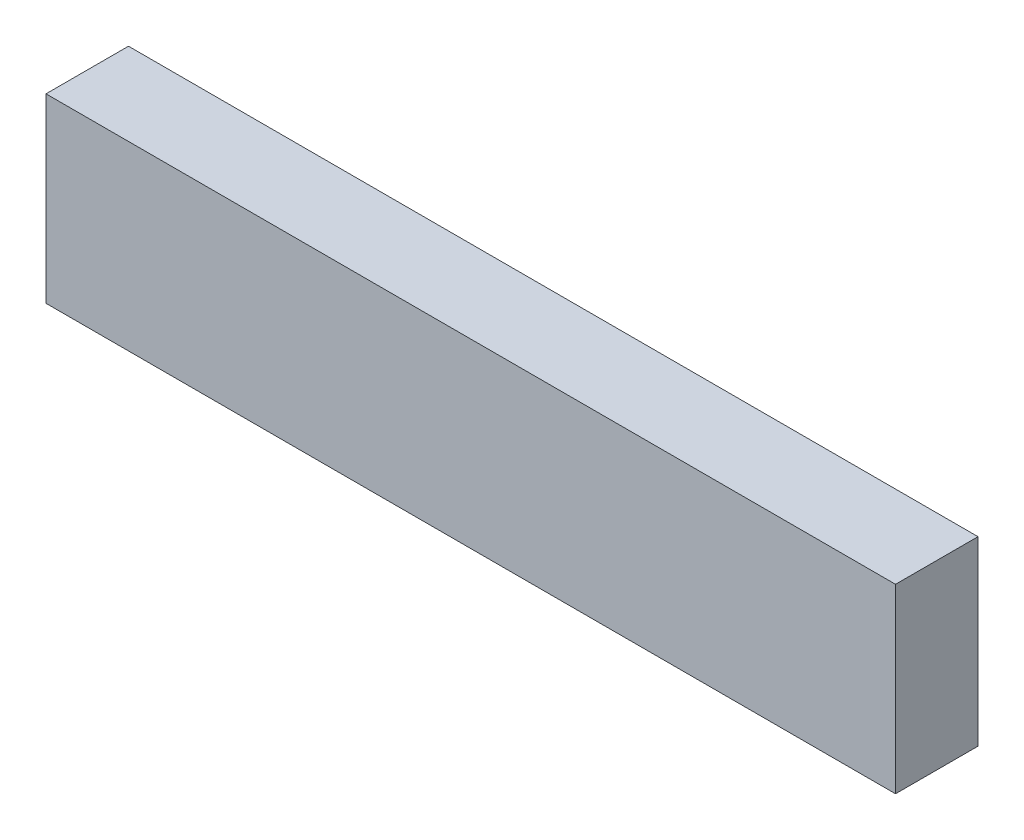
ISO-10303-21;
HEADER;
FILE_DESCRIPTION(('STEP AP214'),'2;1');
FILE_NAME('part.step','',(''),(''),'','','');
FILE_SCHEMA(('AUTOMOTIVE_DESIGN { 1 0 10303 214 1 1 1 1 }'));
ENDSEC;
DATA;
#1=APPLICATION_CONTEXT('core data for automotive mechanical design processes');
#2=APPLICATION_PROTOCOL_DEFINITION('international standard','automotive_design',2000,#1);
#3=PRODUCT_CONTEXT('',#1,'mechanical');
#4=PRODUCT('Part','Part','',(#3));
#5=PRODUCT_RELATED_PRODUCT_CATEGORY('part','',(#4));
#6=PRODUCT_DEFINITION_FORMATION('','',#4);
#7=PRODUCT_DEFINITION_CONTEXT('part definition',#1,'design');
#8=PRODUCT_DEFINITION('design','',#6,#7);
#9=PRODUCT_DEFINITION_SHAPE('','',#8);
#10=(LENGTH_UNIT() NAMED_UNIT(*) SI_UNIT(.MILLI.,.METRE.));
#11=(NAMED_UNIT(*) PLANE_ANGLE_UNIT() SI_UNIT($,.RADIAN.));
#12=(NAMED_UNIT(*) SI_UNIT($,.STERADIAN.) SOLID_ANGLE_UNIT());
#13=UNCERTAINTY_MEASURE_WITH_UNIT(LENGTH_MEASURE(1.E-05),#10,'distance_accuracy_value','');
#14=(GEOMETRIC_REPRESENTATION_CONTEXT(3) GLOBAL_UNCERTAINTY_ASSIGNED_CONTEXT((#13)) GLOBAL_UNIT_ASSIGNED_CONTEXT((#10,
#11,#12)) REPRESENTATION_CONTEXT('',''));
#15=CARTESIAN_POINT('',(0.,0.,0.));
#16=DIRECTION('',(0.,0.,1.));
#17=DIRECTION('',(1.,0.,0.));
#18=AXIS2_PLACEMENT_3D('',#15,#16,#17);
#19=CARTESIAN_POINT('',(25.75,11.,2.5));
#20=DIRECTION('',(-1.,0.,0.));
#21=DIRECTION('',(0.,0.,1.));
#22=AXIS2_PLACEMENT_3D('',#19,#20,#21);
#23=PLANE('',#22);
#24=DIRECTION('',(0.,0.,-1.));
#25=VECTOR('',#24,1.);
#26=CARTESIAN_POINT('',(25.75,0.,2.5));
#27=LINE('',#26,#25);
#28=CARTESIAN_POINT('',(25.75,0.,2.5));
#29=VERTEX_POINT('',#28);
#30=CARTESIAN_POINT('',(25.75,0.,-2.5));
#31=VERTEX_POINT('',#30);
#32=EDGE_CURVE('E97',#29,#31,#27,.T.);
#33=ORIENTED_EDGE('',*,*,#32,.T.);
#34=DIRECTION('',(0.,-1.,0.));
#35=VECTOR('',#34,1.);
#36=CARTESIAN_POINT('',(25.75,11.,-2.5));
#37=LINE('',#36,#35);
#38=CARTESIAN_POINT('',(25.75,11.,-2.5));
#39=VERTEX_POINT('',#38);
#40=EDGE_CURVE('E11',#39,#31,#37,.T.);
#41=ORIENTED_EDGE('',*,*,#40,.F.);
#42=DIRECTION('',(0.,0.,-1.));
#43=VECTOR('',#42,1.);
#44=CARTESIAN_POINT('',(25.75,11.,2.5));
#45=LINE('',#44,#43);
#46=CARTESIAN_POINT('',(25.75,11.,2.5));
#47=VERTEX_POINT('',#46);
#48=EDGE_CURVE('E85',#47,#39,#45,.T.);
#49=ORIENTED_EDGE('',*,*,#48,.F.);
#50=DIRECTION('',(0.,-1.,0.));
#51=VECTOR('',#50,1.);
#52=CARTESIAN_POINT('',(25.75,11.,2.5));
#53=LINE('',#52,#51);
#54=EDGE_CURVE('E93',#47,#29,#53,.T.);
#55=ORIENTED_EDGE('',*,*,#54,.T.);
#56=EDGE_LOOP('',(#33,#41,#49,#55));
#57=FACE_BOUND('',#56,.T.);
#58=ADVANCED_FACE('F34',(#57),#23,.F.);
#59=CARTESIAN_POINT('',(-25.75,11.,-2.5));
#60=DIRECTION('',(0.,0.,1.));
#61=DIRECTION('',(1.,0.,0.));
#62=AXIS2_PLACEMENT_3D('',#59,#60,#61);
#63=PLANE('',#62);
#64=DIRECTION('',(-1.,0.,0.));
#65=VECTOR('',#64,1.);
#66=CARTESIAN_POINT('',(-25.75,0.,-2.5));
#67=LINE('',#66,#65);
#68=CARTESIAN_POINT('',(-25.75,0.,-2.5));
#69=VERTEX_POINT('',#68);
#70=EDGE_CURVE('E89',#31,#69,#67,.T.);
#71=ORIENTED_EDGE('',*,*,#70,.T.);
#72=DIRECTION('',(0.,-1.,0.));
#73=VECTOR('',#72,1.);
#74=CARTESIAN_POINT('',(-25.75,11.,-2.5));
#75=LINE('',#74,#73);
#76=CARTESIAN_POINT('',(-25.75,11.,-2.5));
#77=VERTEX_POINT('',#76);
#78=EDGE_CURVE('E42',#77,#69,#75,.T.);
#79=ORIENTED_EDGE('',*,*,#78,.F.);
#80=DIRECTION('',(-1.,0.,0.));
#81=VECTOR('',#80,1.);
#82=CARTESIAN_POINT('',(-25.75,11.,-2.5));
#83=LINE('',#82,#81);
#84=EDGE_CURVE('E80',#39,#77,#83,.T.);
#85=ORIENTED_EDGE('',*,*,#84,.F.);
#86=ORIENTED_EDGE('',*,*,#40,.T.);
#87=EDGE_LOOP('',(#71,#79,#85,#86));
#88=FACE_BOUND('',#87,.T.);
#89=ADVANCED_FACE('F88',(#88),#63,.F.);
#90=CARTESIAN_POINT('',(-25.75,11.,2.5));
#91=DIRECTION('',(1.,0.,0.));
#92=DIRECTION('',(0.,0.,-1.));
#93=AXIS2_PLACEMENT_3D('',#90,#91,#92);
#94=PLANE('',#93);
#95=DIRECTION('',(0.,0.,1.));
#96=VECTOR('',#95,1.);
#97=CARTESIAN_POINT('',(-25.75,0.,2.5));
#98=LINE('',#97,#96);
#99=CARTESIAN_POINT('',(-25.75,0.,2.5));
#100=VERTEX_POINT('',#99);
#101=EDGE_CURVE('E67',#69,#100,#98,.T.);
#102=ORIENTED_EDGE('',*,*,#101,.T.);
#103=DIRECTION('',(0.,-1.,0.));
#104=VECTOR('',#103,1.);
#105=CARTESIAN_POINT('',(-25.75,11.,2.5));
#106=LINE('',#105,#104);
#107=CARTESIAN_POINT('',(-25.75,11.,2.5));
#108=VERTEX_POINT('',#107);
#109=EDGE_CURVE('E90',#108,#100,#106,.T.);
#110=ORIENTED_EDGE('',*,*,#109,.F.);
#111=DIRECTION('',(0.,0.,1.));
#112=VECTOR('',#111,1.);
#113=CARTESIAN_POINT('',(-25.75,11.,2.5));
#114=LINE('',#113,#112);
#115=EDGE_CURVE('E83',#77,#108,#114,.T.);
#116=ORIENTED_EDGE('',*,*,#115,.F.);
#117=ORIENTED_EDGE('',*,*,#78,.T.);
#118=EDGE_LOOP('',(#102,#110,#116,#117));
#119=FACE_BOUND('',#118,.T.);
#120=ADVANCED_FACE('F91',(#119),#94,.F.);
#121=CARTESIAN_POINT('',(-25.75,11.,2.5));
#122=DIRECTION('',(0.,0.,-1.));
#123=DIRECTION('',(-1.,0.,0.));
#124=AXIS2_PLACEMENT_3D('',#121,#122,#123);
#125=PLANE('',#124);
#126=DIRECTION('',(1.,0.,0.));
#127=VECTOR('',#126,1.);
#128=CARTESIAN_POINT('',(-25.75,0.,2.5));
#129=LINE('',#128,#127);
#130=EDGE_CURVE('E73',#100,#29,#129,.T.);
#131=ORIENTED_EDGE('',*,*,#130,.T.);
#132=ORIENTED_EDGE('',*,*,#54,.F.);
#133=DIRECTION('',(1.,0.,0.));
#134=VECTOR('',#133,1.);
#135=CARTESIAN_POINT('',(-25.75,11.,2.5));
#136=LINE('',#135,#134);
#137=EDGE_CURVE('E50',#108,#47,#136,.T.);
#138=ORIENTED_EDGE('',*,*,#137,.F.);
#139=ORIENTED_EDGE('',*,*,#109,.T.);
#140=EDGE_LOOP('',(#131,#132,#138,#139));
#141=FACE_BOUND('',#140,.T.);
#142=ADVANCED_FACE('F104',(#141),#125,.F.);
#143=CARTESIAN_POINT('',(0.,11.,0.));
#144=DIRECTION('',(0.,-1.,0.));
#145=DIRECTION('',(0.,0.,-1.));
#146=AXIS2_PLACEMENT_3D('',#143,#144,#145);
#147=PLANE('',#146);
#148=ORIENTED_EDGE('',*,*,#48,.T.);
#149=ORIENTED_EDGE('',*,*,#84,.T.);
#150=ORIENTED_EDGE('',*,*,#115,.T.);
#151=ORIENTED_EDGE('',*,*,#137,.T.);
#152=EDGE_LOOP('',(#148,#149,#150,#151));
#153=FACE_BOUND('',#152,.T.);
#154=ADVANCED_FACE('F81',(#153),#147,.F.);
#155=CARTESIAN_POINT('',(0.,0.,0.));
#156=DIRECTION('',(0.,-1.,0.));
#157=DIRECTION('',(0.,0.,-1.));
#158=AXIS2_PLACEMENT_3D('',#155,#156,#157);
#159=PLANE('',#158);
#160=ORIENTED_EDGE('',*,*,#32,.F.);
#161=ORIENTED_EDGE('',*,*,#130,.F.);
#162=ORIENTED_EDGE('',*,*,#101,.F.);
#163=ORIENTED_EDGE('',*,*,#70,.F.);
#164=EDGE_LOOP('',(#160,#161,#162,#163));
#165=FACE_BOUND('',#164,.T.);
#166=ADVANCED_FACE('F107',(#165),#159,.T.);
#167=CLOSED_SHELL('',(#58,#89,#120,#142,#154,#166));
#168=MANIFOLD_SOLID_BREP('B2',#167);
#169=ADVANCED_BREP_SHAPE_REPRESENTATION('',(#18,#168),#14);
#170=SHAPE_DEFINITION_REPRESENTATION(#9,#169);
ENDSEC;
END-ISO-10303-21;
